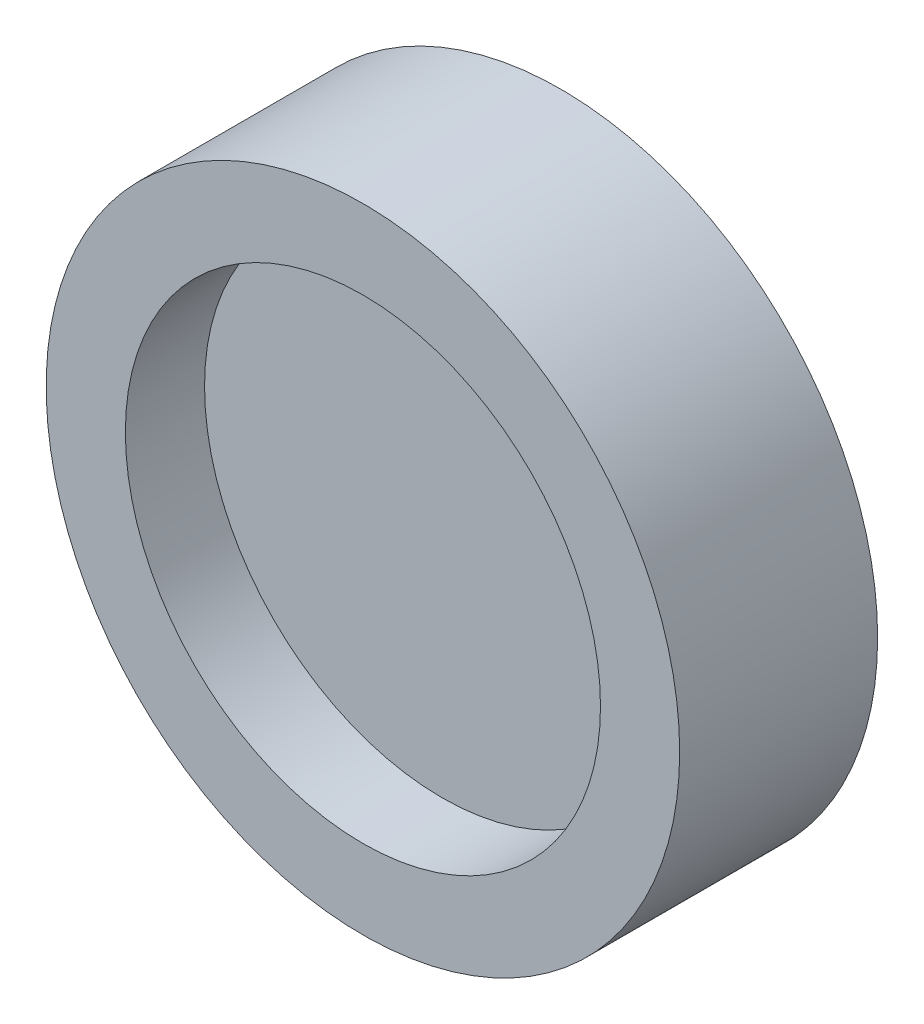
ISO-10303-21;
HEADER;
FILE_DESCRIPTION(('STEP AP214'),'2;1');
FILE_NAME('part.step','',(''),(''),'','','');
FILE_SCHEMA(('AUTOMOTIVE_DESIGN { 1 0 10303 214 1 1 1 1 }'));
ENDSEC;
DATA;
#1=APPLICATION_CONTEXT('core data for automotive mechanical design processes');
#2=APPLICATION_PROTOCOL_DEFINITION('international standard','automotive_design',2000,#1);
#3=PRODUCT_CONTEXT('',#1,'mechanical');
#4=PRODUCT('Part','Part','',(#3));
#5=PRODUCT_RELATED_PRODUCT_CATEGORY('part','',(#4));
#6=PRODUCT_DEFINITION_FORMATION('','',#4);
#7=PRODUCT_DEFINITION_CONTEXT('part definition',#1,'design');
#8=PRODUCT_DEFINITION('design','',#6,#7);
#9=PRODUCT_DEFINITION_SHAPE('','',#8);
#10=(LENGTH_UNIT() NAMED_UNIT(*) SI_UNIT(.MILLI.,.METRE.));
#11=(NAMED_UNIT(*) PLANE_ANGLE_UNIT() SI_UNIT($,.RADIAN.));
#12=(NAMED_UNIT(*) SI_UNIT($,.STERADIAN.) SOLID_ANGLE_UNIT());
#13=UNCERTAINTY_MEASURE_WITH_UNIT(LENGTH_MEASURE(1.E-05),#10,'distance_accuracy_value','');
#14=(GEOMETRIC_REPRESENTATION_CONTEXT(3) GLOBAL_UNCERTAINTY_ASSIGNED_CONTEXT((#13)) GLOBAL_UNIT_ASSIGNED_CONTEXT((#10,
#11,#12)) REPRESENTATION_CONTEXT('',''));
#15=CARTESIAN_POINT('',(0.,0.,0.));
#16=DIRECTION('',(0.,0.,1.));
#17=DIRECTION('',(1.,0.,0.));
#18=AXIS2_PLACEMENT_3D('',#15,#16,#17);
#19=CARTESIAN_POINT('',(0.,0.,5.));
#20=DIRECTION('',(0.,0.,-1.));
#21=DIRECTION('',(-1.,0.,0.));
#22=AXIS2_PLACEMENT_3D('',#19,#20,#21);
#23=CYLINDRICAL_SURFACE('',#22,8.);
#24=CARTESIAN_POINT('',(0.,0.,5.));
#25=DIRECTION('',(0.,0.,1.));
#26=DIRECTION('',(1.,0.,0.));
#27=AXIS2_PLACEMENT_3D('',#24,#25,#26);
#28=CIRCLE('',#27,8.);
#29=CARTESIAN_POINT('',(8.,0.,5.));
#30=VERTEX_POINT('',#29);
#31=EDGE_CURVE('E10',#30,#30,#28,.T.);
#32=ORIENTED_EDGE('',*,*,#31,.F.);
#33=EDGE_LOOP('',(#32));
#34=FACE_BOUND('',#33,.T.);
#35=CARTESIAN_POINT('',(0.,0.,0.));
#36=DIRECTION('',(0.,0.,1.));
#37=DIRECTION('',(1.,0.,0.));
#38=AXIS2_PLACEMENT_3D('',#35,#36,#37);
#39=CIRCLE('',#38,8.);
#40=CARTESIAN_POINT('',(8.,0.,0.));
#41=VERTEX_POINT('',#40);
#42=EDGE_CURVE('E36',#41,#41,#39,.T.);
#43=ORIENTED_EDGE('',*,*,#42,.T.);
#44=EDGE_LOOP('',(#43));
#45=FACE_BOUND('',#44,.T.);
#46=ADVANCED_FACE('F33',(#34,#45),#23,.T.);
#47=CARTESIAN_POINT('',(0.,0.,5.));
#48=DIRECTION('',(0.,0.,1.));
#49=DIRECTION('',(1.,0.,0.));
#50=AXIS2_PLACEMENT_3D('',#47,#48,#49);
#51=PLANE('',#50);
#52=CARTESIAN_POINT('',(0.,0.,5.));
#53=DIRECTION('',(0.,0.,1.));
#54=DIRECTION('',(1.,0.,0.));
#55=AXIS2_PLACEMENT_3D('',#52,#53,#54);
#56=CIRCLE('',#55,6.);
#57=CARTESIAN_POINT('',(6.,0.,5.));
#58=VERTEX_POINT('',#57);
#59=EDGE_CURVE('E45',#58,#58,#56,.T.);
#60=ORIENTED_EDGE('',*,*,#59,.F.);
#61=EDGE_LOOP('',(#60));
#62=FACE_BOUND('',#61,.T.);
#63=ORIENTED_EDGE('',*,*,#31,.T.);
#64=EDGE_LOOP('',(#63));
#65=FACE_BOUND('',#64,.T.);
#66=ADVANCED_FACE('F60',(#62,#65),#51,.T.);
#67=CARTESIAN_POINT('',(0.,0.,0.));
#68=DIRECTION('',(0.,0.,1.));
#69=DIRECTION('',(1.,0.,0.));
#70=AXIS2_PLACEMENT_3D('',#67,#68,#69);
#71=PLANE('',#70);
#72=ORIENTED_EDGE('',*,*,#42,.F.);
#73=EDGE_LOOP('',(#72));
#74=FACE_BOUND('',#73,.T.);
#75=ADVANCED_FACE('F56',(#74),#71,.F.);
#76=CARTESIAN_POINT('',(0.,0.,3.));
#77=DIRECTION('',(0.,0.,1.));
#78=DIRECTION('',(1.,0.,0.));
#79=AXIS2_PLACEMENT_3D('',#76,#77,#78);
#80=CYLINDRICAL_SURFACE('',#79,6.);
#81=CARTESIAN_POINT('',(0.,0.,3.));
#82=DIRECTION('',(0.,0.,1.));
#83=DIRECTION('',(1.,0.,0.));
#84=AXIS2_PLACEMENT_3D('',#81,#82,#83);
#85=CIRCLE('',#84,6.);
#86=CARTESIAN_POINT('',(6.,0.,3.));
#87=VERTEX_POINT('',#86);
#88=EDGE_CURVE('E43',#87,#87,#85,.T.);
#89=ORIENTED_EDGE('',*,*,#88,.F.);
#90=EDGE_LOOP('',(#89));
#91=FACE_BOUND('',#90,.T.);
#92=ORIENTED_EDGE('',*,*,#59,.T.);
#93=EDGE_LOOP('',(#92));
#94=FACE_BOUND('',#93,.T.);
#95=ADVANCED_FACE('F53',(#91,#94),#80,.F.);
#96=CARTESIAN_POINT('',(0.,0.,3.));
#97=DIRECTION('',(0.,0.,1.));
#98=DIRECTION('',(1.,0.,0.));
#99=AXIS2_PLACEMENT_3D('',#96,#97,#98);
#100=PLANE('',#99);
#101=ORIENTED_EDGE('',*,*,#88,.T.);
#102=EDGE_LOOP('',(#101));
#103=FACE_BOUND('',#102,.T.);
#104=ADVANCED_FACE('F51',(#103),#100,.T.);
#105=CLOSED_SHELL('',(#46,#66,#75,#95,#104));
#106=MANIFOLD_SOLID_BREP('B2',#105);
#107=ADVANCED_BREP_SHAPE_REPRESENTATION('',(#18,#106),#14);
#108=SHAPE_DEFINITION_REPRESENTATION(#9,#107);
ENDSEC;
END-ISO-10303-21;
